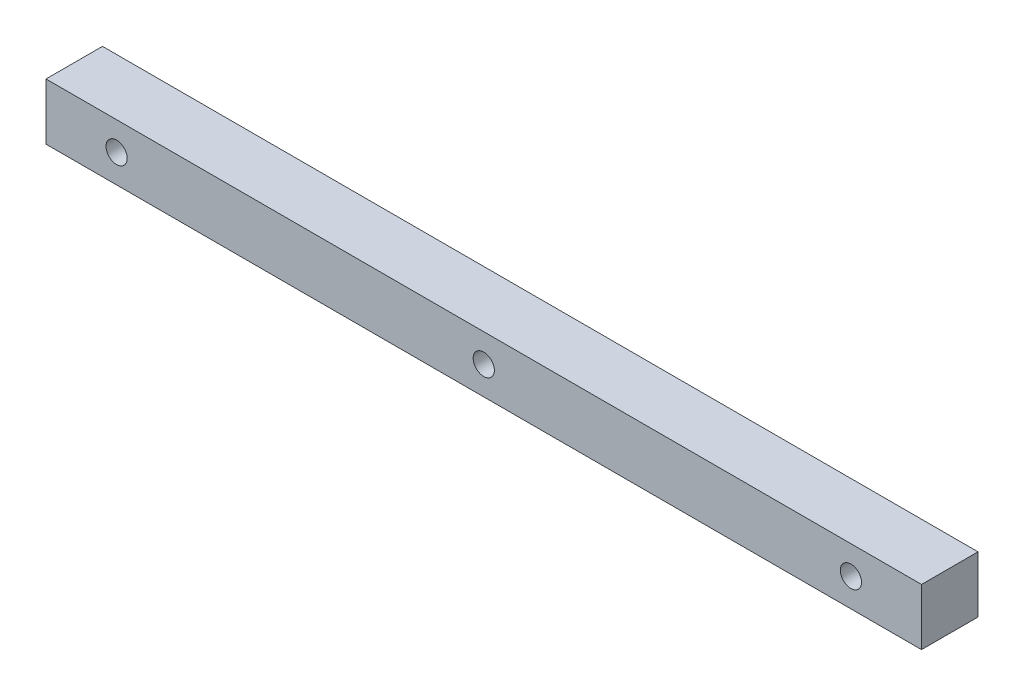
ISO-10303-21;
HEADER;
FILE_DESCRIPTION(('STEP AP214'),'2;1');
FILE_NAME('part.step','',(''),(''),'','','');
FILE_SCHEMA(('AUTOMOTIVE_DESIGN { 1 0 10303 214 1 1 1 1 }'));
ENDSEC;
DATA;
#1=APPLICATION_CONTEXT('core data for automotive mechanical design processes');
#2=APPLICATION_PROTOCOL_DEFINITION('international standard','automotive_design',2000,#1);
#3=PRODUCT_CONTEXT('',#1,'mechanical');
#4=PRODUCT('Part','Part','',(#3));
#5=PRODUCT_RELATED_PRODUCT_CATEGORY('part','',(#4));
#6=PRODUCT_DEFINITION_FORMATION('','',#4);
#7=PRODUCT_DEFINITION_CONTEXT('part definition',#1,'design');
#8=PRODUCT_DEFINITION('design','',#6,#7);
#9=PRODUCT_DEFINITION_SHAPE('','',#8);
#10=(LENGTH_UNIT() NAMED_UNIT(*) SI_UNIT(.MILLI.,.METRE.));
#11=(NAMED_UNIT(*) PLANE_ANGLE_UNIT() SI_UNIT($,.RADIAN.));
#12=(NAMED_UNIT(*) SI_UNIT($,.STERADIAN.) SOLID_ANGLE_UNIT());
#13=UNCERTAINTY_MEASURE_WITH_UNIT(LENGTH_MEASURE(1.E-05),#10,'distance_accuracy_value','');
#14=(GEOMETRIC_REPRESENTATION_CONTEXT(3) GLOBAL_UNCERTAINTY_ASSIGNED_CONTEXT((#13)) GLOBAL_UNIT_ASSIGNED_CONTEXT((#10,
#11,#12)) REPRESENTATION_CONTEXT('',''));
#15=CARTESIAN_POINT('',(0.,0.,0.));
#16=DIRECTION('',(0.,0.,1.));
#17=DIRECTION('',(1.,0.,0.));
#18=AXIS2_PLACEMENT_3D('',#15,#16,#17);
#19=CARTESIAN_POINT('',(0.,0.,8.));
#20=DIRECTION('',(0.,0.,-1.));
#21=DIRECTION('',(-1.,0.,0.));
#22=AXIS2_PLACEMENT_3D('',#19,#20,#21);
#23=PLANE('',#22);
#24=CARTESIAN_POINT('',(10.,4.,8.));
#25=DIRECTION('',(0.,0.,1.));
#26=DIRECTION('',(1.,0.,0.));
#27=AXIS2_PLACEMENT_3D('',#24,#25,#26);
#28=CIRCLE('',#27,1.5);
#29=CARTESIAN_POINT('',(11.5,4.,8.));
#30=VERTEX_POINT('',#29);
#31=EDGE_CURVE('E116',#30,#30,#28,.T.);
#32=ORIENTED_EDGE('',*,*,#31,.F.);
#33=EDGE_LOOP('',(#32));
#34=FACE_BOUND('',#33,.T.);
#35=DIRECTION('',(0.,-1.,0.));
#36=VECTOR('',#35,1.);
#37=CARTESIAN_POINT('',(0.,0.,8.));
#38=LINE('',#37,#36);
#39=CARTESIAN_POINT('',(0.,8.,8.));
#40=VERTEX_POINT('',#39);
#41=CARTESIAN_POINT('',(0.,0.,8.));
#42=VERTEX_POINT('',#41);
#43=EDGE_CURVE('E86',#40,#42,#38,.T.);
#44=ORIENTED_EDGE('',*,*,#43,.T.);
#45=DIRECTION('',(1.,0.,0.));
#46=VECTOR('',#45,1.);
#47=CARTESIAN_POINT('',(0.,0.,8.));
#48=LINE('',#47,#46);
#49=CARTESIAN_POINT('',(124.,0.,8.));
#50=VERTEX_POINT('',#49);
#51=EDGE_CURVE('E81',#42,#50,#48,.T.);
#52=ORIENTED_EDGE('',*,*,#51,.T.);
#53=DIRECTION('',(0.,1.,0.));
#54=VECTOR('',#53,1.);
#55=CARTESIAN_POINT('',(124.,0.,8.));
#56=LINE('',#55,#54);
#57=CARTESIAN_POINT('',(124.,8.,8.));
#58=VERTEX_POINT('',#57);
#59=EDGE_CURVE('E84',#50,#58,#56,.T.);
#60=ORIENTED_EDGE('',*,*,#59,.T.);
#61=DIRECTION('',(-1.,0.,0.));
#62=VECTOR('',#61,1.);
#63=CARTESIAN_POINT('',(0.,8.,8.));
#64=LINE('',#63,#62);
#65=EDGE_CURVE('E51',#58,#40,#64,.T.);
#66=ORIENTED_EDGE('',*,*,#65,.T.);
#67=EDGE_LOOP('',(#44,#52,#60,#66));
#68=FACE_BOUND('',#67,.T.);
#69=CARTESIAN_POINT('',(62.,4.,8.));
#70=DIRECTION('',(0.,0.,1.));
#71=DIRECTION('',(1.,0.,0.));
#72=AXIS2_PLACEMENT_3D('',#69,#70,#71);
#73=CIRCLE('',#72,1.5);
#74=CARTESIAN_POINT('',(63.5,4.,8.));
#75=VERTEX_POINT('',#74);
#76=EDGE_CURVE('E101',#75,#75,#73,.T.);
#77=ORIENTED_EDGE('',*,*,#76,.F.);
#78=EDGE_LOOP('',(#77));
#79=FACE_BOUND('',#78,.T.);
#80=CARTESIAN_POINT('',(114.,4.,8.));
#81=DIRECTION('',(0.,0.,1.));
#82=DIRECTION('',(-1.,0.,0.));
#83=AXIS2_PLACEMENT_3D('',#80,#81,#82);
#84=CIRCLE('',#83,1.5);
#85=CARTESIAN_POINT('',(112.5,4.,8.));
#86=VERTEX_POINT('',#85);
#87=EDGE_CURVE('E122',#86,#86,#84,.T.);
#88=ORIENTED_EDGE('',*,*,#87,.F.);
#89=EDGE_LOOP('',(#88));
#90=FACE_BOUND('',#89,.T.);
#91=ADVANCED_FACE('F34',(#34,#68,#79,#90),#23,.F.);
#92=CARTESIAN_POINT('',(0.,0.,0.));
#93=DIRECTION('',(0.,0.,-1.));
#94=DIRECTION('',(-1.,0.,0.));
#95=AXIS2_PLACEMENT_3D('',#92,#93,#94);
#96=PLANE('',#95);
#97=CARTESIAN_POINT('',(10.,4.,0.));
#98=DIRECTION('',(0.,0.,1.));
#99=DIRECTION('',(1.,0.,0.));
#100=AXIS2_PLACEMENT_3D('',#97,#98,#99);
#101=CIRCLE('',#100,1.5);
#102=CARTESIAN_POINT('',(11.5,4.,0.));
#103=VERTEX_POINT('',#102);
#104=EDGE_CURVE('E119',#103,#103,#101,.T.);
#105=ORIENTED_EDGE('',*,*,#104,.T.);
#106=EDGE_LOOP('',(#105));
#107=FACE_BOUND('',#106,.T.);
#108=DIRECTION('',(0.,-1.,0.));
#109=VECTOR('',#108,1.);
#110=CARTESIAN_POINT('',(0.,0.,0.));
#111=LINE('',#110,#109);
#112=CARTESIAN_POINT('',(0.,8.,0.));
#113=VERTEX_POINT('',#112);
#114=CARTESIAN_POINT('',(0.,0.,0.));
#115=VERTEX_POINT('',#114);
#116=EDGE_CURVE('E98',#113,#115,#111,.T.);
#117=ORIENTED_EDGE('',*,*,#116,.F.);
#118=DIRECTION('',(-1.,0.,0.));
#119=VECTOR('',#118,1.);
#120=CARTESIAN_POINT('',(0.,8.,0.));
#121=LINE('',#120,#119);
#122=CARTESIAN_POINT('',(124.,8.,0.));
#123=VERTEX_POINT('',#122);
#124=EDGE_CURVE('E74',#123,#113,#121,.T.);
#125=ORIENTED_EDGE('',*,*,#124,.F.);
#126=DIRECTION('',(0.,1.,0.));
#127=VECTOR('',#126,1.);
#128=CARTESIAN_POINT('',(124.,0.,0.));
#129=LINE('',#128,#127);
#130=CARTESIAN_POINT('',(124.,0.,0.));
#131=VERTEX_POINT('',#130);
#132=EDGE_CURVE('E68',#131,#123,#129,.T.);
#133=ORIENTED_EDGE('',*,*,#132,.F.);
#134=DIRECTION('',(1.,0.,0.));
#135=VECTOR('',#134,1.);
#136=CARTESIAN_POINT('',(0.,0.,0.));
#137=LINE('',#136,#135);
#138=EDGE_CURVE('E90',#115,#131,#137,.T.);
#139=ORIENTED_EDGE('',*,*,#138,.F.);
#140=EDGE_LOOP('',(#117,#125,#133,#139));
#141=FACE_BOUND('',#140,.T.);
#142=CARTESIAN_POINT('',(62.,4.,0.));
#143=DIRECTION('',(0.,0.,1.));
#144=DIRECTION('',(1.,0.,0.));
#145=AXIS2_PLACEMENT_3D('',#142,#143,#144);
#146=CIRCLE('',#145,1.5);
#147=CARTESIAN_POINT('',(63.5,4.,0.));
#148=VERTEX_POINT('',#147);
#149=EDGE_CURVE('E113',#148,#148,#146,.T.);
#150=ORIENTED_EDGE('',*,*,#149,.T.);
#151=EDGE_LOOP('',(#150));
#152=FACE_BOUND('',#151,.T.);
#153=CARTESIAN_POINT('',(114.,4.,0.));
#154=DIRECTION('',(0.,0.,1.));
#155=DIRECTION('',(-1.,0.,0.));
#156=AXIS2_PLACEMENT_3D('',#153,#154,#155);
#157=CIRCLE('',#156,1.5);
#158=CARTESIAN_POINT('',(112.5,4.,0.));
#159=VERTEX_POINT('',#158);
#160=EDGE_CURVE('E125',#159,#159,#157,.T.);
#161=ORIENTED_EDGE('',*,*,#160,.T.);
#162=EDGE_LOOP('',(#161));
#163=FACE_BOUND('',#162,.T.);
#164=ADVANCED_FACE('F109',(#107,#141,#152,#163),#96,.T.);
#165=CARTESIAN_POINT('',(0.,0.,8.));
#166=DIRECTION('',(1.,0.,0.));
#167=DIRECTION('',(0.,0.,-1.));
#168=AXIS2_PLACEMENT_3D('',#165,#166,#167);
#169=PLANE('',#168);
#170=ORIENTED_EDGE('',*,*,#116,.T.);
#171=DIRECTION('',(0.,0.,-1.));
#172=VECTOR('',#171,1.);
#173=CARTESIAN_POINT('',(0.,0.,8.));
#174=LINE('',#173,#172);
#175=EDGE_CURVE('E11',#42,#115,#174,.T.);
#176=ORIENTED_EDGE('',*,*,#175,.F.);
#177=ORIENTED_EDGE('',*,*,#43,.F.);
#178=DIRECTION('',(0.,0.,-1.));
#179=VECTOR('',#178,1.);
#180=CARTESIAN_POINT('',(0.,8.,8.));
#181=LINE('',#180,#179);
#182=EDGE_CURVE('E94',#40,#113,#181,.T.);
#183=ORIENTED_EDGE('',*,*,#182,.T.);
#184=EDGE_LOOP('',(#170,#176,#177,#183));
#185=FACE_BOUND('',#184,.T.);
#186=ADVANCED_FACE('F36',(#185),#169,.F.);
#187=CARTESIAN_POINT('',(0.,0.,8.));
#188=DIRECTION('',(0.,1.,0.));
#189=DIRECTION('',(0.,0.,1.));
#190=AXIS2_PLACEMENT_3D('',#187,#188,#189);
#191=PLANE('',#190);
#192=ORIENTED_EDGE('',*,*,#138,.T.);
#193=DIRECTION('',(0.,0.,-1.));
#194=VECTOR('',#193,1.);
#195=CARTESIAN_POINT('',(124.,0.,8.));
#196=LINE('',#195,#194);
#197=EDGE_CURVE('E43',#50,#131,#196,.T.);
#198=ORIENTED_EDGE('',*,*,#197,.F.);
#199=ORIENTED_EDGE('',*,*,#51,.F.);
#200=ORIENTED_EDGE('',*,*,#175,.T.);
#201=EDGE_LOOP('',(#192,#198,#199,#200));
#202=FACE_BOUND('',#201,.T.);
#203=ADVANCED_FACE('F89',(#202),#191,.F.);
#204=CARTESIAN_POINT('',(124.,0.,8.));
#205=DIRECTION('',(-1.,0.,0.));
#206=DIRECTION('',(0.,0.,1.));
#207=AXIS2_PLACEMENT_3D('',#204,#205,#206);
#208=PLANE('',#207);
#209=ORIENTED_EDGE('',*,*,#132,.T.);
#210=DIRECTION('',(0.,0.,-1.));
#211=VECTOR('',#210,1.);
#212=CARTESIAN_POINT('',(124.,8.,8.));
#213=LINE('',#212,#211);
#214=EDGE_CURVE('E91',#58,#123,#213,.T.);
#215=ORIENTED_EDGE('',*,*,#214,.F.);
#216=ORIENTED_EDGE('',*,*,#59,.F.);
#217=ORIENTED_EDGE('',*,*,#197,.T.);
#218=EDGE_LOOP('',(#209,#215,#216,#217));
#219=FACE_BOUND('',#218,.T.);
#220=ADVANCED_FACE('F92',(#219),#208,.F.);
#221=CARTESIAN_POINT('',(0.,8.,8.));
#222=DIRECTION('',(0.,-1.,0.));
#223=DIRECTION('',(0.,0.,-1.));
#224=AXIS2_PLACEMENT_3D('',#221,#222,#223);
#225=PLANE('',#224);
#226=ORIENTED_EDGE('',*,*,#124,.T.);
#227=ORIENTED_EDGE('',*,*,#182,.F.);
#228=ORIENTED_EDGE('',*,*,#65,.F.);
#229=ORIENTED_EDGE('',*,*,#214,.T.);
#230=EDGE_LOOP('',(#226,#227,#228,#229));
#231=FACE_BOUND('',#230,.T.);
#232=ADVANCED_FACE('F106',(#231),#225,.F.);
#233=CARTESIAN_POINT('',(62.,4.,8.));
#234=DIRECTION('',(0.,0.,-1.));
#235=DIRECTION('',(-1.,0.,0.));
#236=AXIS2_PLACEMENT_3D('',#233,#234,#235);
#237=CYLINDRICAL_SURFACE('',#236,1.5);
#238=ORIENTED_EDGE('',*,*,#76,.T.);
#239=EDGE_LOOP('',(#238));
#240=FACE_BOUND('',#239,.T.);
#241=ORIENTED_EDGE('',*,*,#149,.F.);
#242=EDGE_LOOP('',(#241));
#243=FACE_BOUND('',#242,.T.);
#244=ADVANCED_FACE('F144',(#240,#243),#237,.F.);
#245=CARTESIAN_POINT('',(10.,4.,8.));
#246=DIRECTION('',(0.,0.,-1.));
#247=DIRECTION('',(-1.,0.,0.));
#248=AXIS2_PLACEMENT_3D('',#245,#246,#247);
#249=CYLINDRICAL_SURFACE('',#248,1.5);
#250=ORIENTED_EDGE('',*,*,#31,.T.);
#251=EDGE_LOOP('',(#250));
#252=FACE_BOUND('',#251,.T.);
#253=ORIENTED_EDGE('',*,*,#104,.F.);
#254=EDGE_LOOP('',(#253));
#255=FACE_BOUND('',#254,.T.);
#256=ADVANCED_FACE('F190',(#252,#255),#249,.F.);
#257=CARTESIAN_POINT('',(114.,4.,8.));
#258=DIRECTION('',(0.,0.,-1.));
#259=DIRECTION('',(-1.,0.,0.));
#260=AXIS2_PLACEMENT_3D('',#257,#258,#259);
#261=CYLINDRICAL_SURFACE('',#260,1.5);
#262=ORIENTED_EDGE('',*,*,#87,.T.);
#263=EDGE_LOOP('',(#262));
#264=FACE_BOUND('',#263,.T.);
#265=ORIENTED_EDGE('',*,*,#160,.F.);
#266=EDGE_LOOP('',(#265));
#267=FACE_BOUND('',#266,.T.);
#268=ADVANCED_FACE('F131',(#264,#267),#261,.F.);
#269=CLOSED_SHELL('',(#91,#164,#186,#203,#220,#232,#244,#256,#268));
#270=MANIFOLD_SOLID_BREP('B2',#269);
#271=ADVANCED_BREP_SHAPE_REPRESENTATION('',(#18,#270),#14);
#272=SHAPE_DEFINITION_REPRESENTATION(#9,#271);
ENDSEC;
END-ISO-10303-21;
